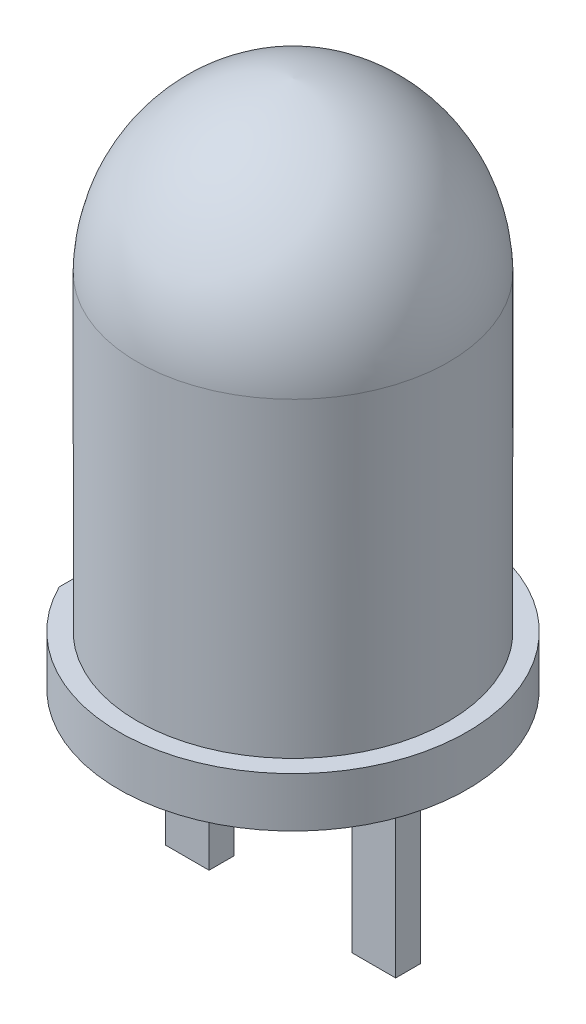
ISO-10303-21;
HEADER;
FILE_DESCRIPTION(('STEP AP214'),'2;1');
FILE_NAME('part.step','',(''),(''),'','','');
FILE_SCHEMA(('AUTOMOTIVE_DESIGN { 1 0 10303 214 1 1 1 1 }'));
ENDSEC;
DATA;
#1=APPLICATION_CONTEXT('core data for automotive mechanical design processes');
#2=APPLICATION_PROTOCOL_DEFINITION('international standard','automotive_design',2000,#1);
#3=PRODUCT_CONTEXT('',#1,'mechanical');
#4=PRODUCT('Part','Part','',(#3));
#5=PRODUCT_RELATED_PRODUCT_CATEGORY('part','',(#4));
#6=PRODUCT_DEFINITION_FORMATION('','',#4);
#7=PRODUCT_DEFINITION_CONTEXT('part definition',#1,'design');
#8=PRODUCT_DEFINITION('design','',#6,#7);
#9=PRODUCT_DEFINITION_SHAPE('','',#8);
#10=(LENGTH_UNIT() NAMED_UNIT(*) SI_UNIT(.MILLI.,.METRE.));
#11=(NAMED_UNIT(*) PLANE_ANGLE_UNIT() SI_UNIT($,.RADIAN.));
#12=(NAMED_UNIT(*) SI_UNIT($,.STERADIAN.) SOLID_ANGLE_UNIT());
#13=UNCERTAINTY_MEASURE_WITH_UNIT(LENGTH_MEASURE(1.E-05),#10,'distance_accuracy_value','');
#14=(GEOMETRIC_REPRESENTATION_CONTEXT(3) GLOBAL_UNCERTAINTY_ASSIGNED_CONTEXT((#13)) GLOBAL_UNIT_ASSIGNED_CONTEXT((#10,
#11,#12)) REPRESENTATION_CONTEXT('',''));
#15=CARTESIAN_POINT('',(0.,0.,0.));
#16=DIRECTION('',(0.,0.,1.));
#17=DIRECTION('',(1.,0.,0.));
#18=AXIS2_PLACEMENT_3D('',#15,#16,#17);
#19=CARTESIAN_POINT('',(0.,0.,0.));
#20=DIRECTION('',(0.,-1.,0.));
#21=DIRECTION('',(0.,0.,-1.));
#22=AXIS2_PLACEMENT_3D('',#19,#20,#21);
#23=PLANE('',#22);
#24=DIRECTION('',(0.,0.,-1.));
#25=VECTOR('',#24,1.);
#26=CARTESIAN_POINT('',(-1.15,0.,0.2));
#27=LINE('',#26,#25);
#28=CARTESIAN_POINT('',(-1.15,0.,0.2));
#29=VERTEX_POINT('',#28);
#30=CARTESIAN_POINT('',(-1.15,0.,-0.2));
#31=VERTEX_POINT('',#30);
#32=EDGE_CURVE('E89',#29,#31,#27,.T.);
#33=ORIENTED_EDGE('',*,*,#32,.T.);
#34=DIRECTION('',(1.,0.,0.));
#35=VECTOR('',#34,1.);
#36=CARTESIAN_POINT('',(0.,0.,-0.2));
#37=LINE('',#36,#35);
#38=CARTESIAN_POINT('',(-1.85,0.,-0.2));
#39=VERTEX_POINT('',#38);
#40=EDGE_CURVE('E94',#39,#31,#37,.T.);
#41=ORIENTED_EDGE('',*,*,#40,.F.);
#42=DIRECTION('',(0.,0.,-1.));
#43=VECTOR('',#42,1.);
#44=CARTESIAN_POINT('',(-1.85,0.,0.2));
#45=LINE('',#44,#43);
#46=CARTESIAN_POINT('',(-1.85,0.,0.2));
#47=VERTEX_POINT('',#46);
#48=EDGE_CURVE('E152',#47,#39,#45,.T.);
#49=ORIENTED_EDGE('',*,*,#48,.F.);
#50=DIRECTION('',(1.,0.,0.));
#51=VECTOR('',#50,1.);
#52=CARTESIAN_POINT('',(-1.85,0.,0.2));
#53=LINE('',#52,#51);
#54=EDGE_CURVE('E156',#47,#29,#53,.T.);
#55=ORIENTED_EDGE('',*,*,#54,.T.);
#56=EDGE_LOOP('',(#33,#41,#49,#55));
#57=FACE_BOUND('',#56,.T.);
#58=DIRECTION('',(0.,0.,1.));
#59=VECTOR('',#58,1.);
#60=CARTESIAN_POINT('',(-2.5,0.,0.));
#61=LINE('',#60,#59);
#62=CARTESIAN_POINT('',(-2.5,0.,-1.26095202129185));
#63=VERTEX_POINT('',#62);
#64=CARTESIAN_POINT('',(-2.5,0.,1.26095202129185));
#65=VERTEX_POINT('',#64);
#66=EDGE_CURVE('E225',#63,#65,#61,.T.);
#67=ORIENTED_EDGE('',*,*,#66,.F.);
#68=CARTESIAN_POINT('',(0.,0.,0.));
#69=DIRECTION('',(0.,-1.,0.));
#70=DIRECTION('',(0.,0.,-1.));
#71=AXIS2_PLACEMENT_3D('',#68,#69,#70);
#72=CIRCLE('',#71,2.8);
#73=EDGE_CURVE('E227',#63,#65,#72,.T.);
#74=ORIENTED_EDGE('',*,*,#73,.T.);
#75=EDGE_LOOP('',(#67,#74));
#76=FACE_BOUND('',#75,.T.);
#77=DIRECTION('',(0.,0.,-1.));
#78=VECTOR('',#77,1.);
#79=CARTESIAN_POINT('',(1.15,0.,0.));
#80=LINE('',#79,#78);
#81=CARTESIAN_POINT('',(1.15,0.,0.2));
#82=VERTEX_POINT('',#81);
#83=CARTESIAN_POINT('',(1.15,0.,-0.2));
#84=VERTEX_POINT('',#83);
#85=EDGE_CURVE('E205',#82,#84,#80,.T.);
#86=ORIENTED_EDGE('',*,*,#85,.F.);
#87=DIRECTION('',(-1.,0.,0.));
#88=VECTOR('',#87,1.);
#89=CARTESIAN_POINT('',(0.,0.,0.2));
#90=LINE('',#89,#88);
#91=CARTESIAN_POINT('',(1.85,0.,0.2));
#92=VERTEX_POINT('',#91);
#93=EDGE_CURVE('E161',#92,#82,#90,.T.);
#94=ORIENTED_EDGE('',*,*,#93,.F.);
#95=DIRECTION('',(0.,0.,-1.));
#96=VECTOR('',#95,1.);
#97=CARTESIAN_POINT('',(1.85,0.,0.));
#98=LINE('',#97,#96);
#99=CARTESIAN_POINT('',(1.85,0.,-0.2));
#100=VERTEX_POINT('',#99);
#101=EDGE_CURVE('E194',#92,#100,#98,.T.);
#102=ORIENTED_EDGE('',*,*,#101,.T.);
#103=DIRECTION('',(-1.,0.,0.));
#104=VECTOR('',#103,1.);
#105=CARTESIAN_POINT('',(0.,0.,-0.2));
#106=LINE('',#105,#104);
#107=EDGE_CURVE('E208',#100,#84,#106,.T.);
#108=ORIENTED_EDGE('',*,*,#107,.T.);
#109=EDGE_LOOP('',(#86,#94,#102,#108));
#110=FACE_BOUND('',#109,.T.);
#111=ADVANCED_FACE('F75',(#57,#76,#110),#23,.T.);
#112=CARTESIAN_POINT('',(0.,5.76136244683429,0.249728557418962));
#113=DIRECTION('',(-1.,0.,0.));
#114=DIRECTION('',(0.,0.,-1.));
#115=AXIS2_PLACEMENT_3D('',#112,#113,#114);
#116=CIRCLE('',#115,2.75);
#117=TRIMMED_CURVE('',#116,(PARAMETER_VALUE(-1.47986066512571)),
(PARAMETER_VALUE(1.47986066512571)),.T.,.PARAMETER.);
#118=CARTESIAN_POINT('',(0.,5.76136244683429,0.));
#119=DIRECTION('',(0.,-1.,0.));
#120=AXIS1_PLACEMENT('',#118,#119);
#121=SURFACE_OF_REVOLUTION('',#117,#120);
#122=CARTESIAN_POINT('',(0.,8.5,0.));
#123=VERTEX_POINT('',#122);
#124=VERTEX_LOOP('',#123);
#125=FACE_BOUND('',#124,.T.);
#126=CARTESIAN_POINT('',(0.,5.8,0.));
#127=DIRECTION('',(0.,-1.,0.));
#128=DIRECTION('',(0.,0.,-1.));
#129=AXIS2_PLACEMENT_3D('',#126,#127,#128);
#130=CIRCLE('',#129,2.5);
#131=CARTESIAN_POINT('',(0.,5.8,-2.5));
#132=VERTEX_POINT('',#131);
#133=EDGE_CURVE('E236',#132,#132,#130,.T.);
#134=ORIENTED_EDGE('',*,*,#133,.F.);
#135=EDGE_LOOP('',(#134));
#136=FACE_BOUND('',#135,.T.);
#137=ADVANCED_FACE('F256',(#125,#136),#121,.T.);
#138=CARTESIAN_POINT('',(0.,0.,0.));
#139=DIRECTION('',(0.,-1.,0.));
#140=DIRECTION('',(0.,0.,-1.));
#141=AXIS2_PLACEMENT_3D('',#138,#139,#140);
#142=CYLINDRICAL_SURFACE('',#141,2.5);
#143=ORIENTED_EDGE('',*,*,#133,.T.);
#144=EDGE_LOOP('',(#143));
#145=FACE_BOUND('',#144,.T.);
#146=CARTESIAN_POINT('',(0.,0.8,0.));
#147=DIRECTION('',(0.,-1.,0.));
#148=DIRECTION('',(0.,0.,-1.));
#149=AXIS2_PLACEMENT_3D('',#146,#147,#148);
#150=CIRCLE('',#149,2.5);
#151=CARTESIAN_POINT('',(-2.5,0.8,0.));
#152=VERTEX_POINT('',#151);
#153=EDGE_CURVE('E233',#152,#152,#150,.T.);
#154=ORIENTED_EDGE('',*,*,#153,.F.);
#155=EDGE_LOOP('',(#154));
#156=FACE_BOUND('',#155,.T.);
#157=ADVANCED_FACE('F254',(#145,#156),#142,.T.);
#158=CARTESIAN_POINT('',(2.8,0.8,0.));
#159=DIRECTION('',(0.,1.,0.));
#160=DIRECTION('',(0.,0.,1.));
#161=AXIS2_PLACEMENT_3D('',#158,#159,#160);
#162=PLANE('',#161);
#163=DIRECTION('',(0.,0.,-1.));
#164=VECTOR('',#163,1.);
#165=CARTESIAN_POINT('',(-2.5,0.8,0.));
#166=LINE('',#165,#164);
#167=CARTESIAN_POINT('',(-2.5,0.8,1.26095202129185));
#168=VERTEX_POINT('',#167);
#169=EDGE_CURVE('E223',#168,#152,#166,.T.);
#170=ORIENTED_EDGE('',*,*,#169,.F.);
#171=CARTESIAN_POINT('',(0.,0.8,0.));
#172=DIRECTION('',(0.,-1.,0.));
#173=DIRECTION('',(0.,0.,-1.));
#174=AXIS2_PLACEMENT_3D('',#171,#172,#173);
#175=CIRCLE('',#174,2.8);
#176=CARTESIAN_POINT('',(-2.5,0.8,-1.26095202129185));
#177=VERTEX_POINT('',#176);
#178=EDGE_CURVE('E230',#177,#168,#175,.T.);
#179=ORIENTED_EDGE('',*,*,#178,.F.);
#180=EDGE_CURVE('E222',#152,#177,#166,.T.);
#181=ORIENTED_EDGE('',*,*,#180,.F.);
#182=ORIENTED_EDGE('',*,*,#153,.T.);
#183=EDGE_LOOP('',(#170,#179,#181,#182));
#184=FACE_BOUND('',#183,.T.);
#185=ADVANCED_FACE('F251',(#184),#162,.T.);
#186=CARTESIAN_POINT('',(0.,0.,0.));
#187=DIRECTION('',(0.,-1.,0.));
#188=DIRECTION('',(0.,0.,-1.));
#189=AXIS2_PLACEMENT_3D('',#186,#187,#188);
#190=CYLINDRICAL_SURFACE('',#189,2.8);
#191=DIRECTION('',(0.,-1.,0.));
#192=VECTOR('',#191,1.);
#193=CARTESIAN_POINT('',(-2.5,0.,1.26095202129185));
#194=LINE('',#193,#192);
#195=EDGE_CURVE('E12',#65,#168,#194,.F.);
#196=ORIENTED_EDGE('',*,*,#195,.F.);
#197=ORIENTED_EDGE('',*,*,#73,.F.);
#198=DIRECTION('',(0.,-1.,0.));
#199=VECTOR('',#198,1.);
#200=CARTESIAN_POINT('',(-2.5,0.,-1.26095202129185));
#201=LINE('',#200,#199);
#202=EDGE_CURVE('E82',#177,#63,#201,.T.);
#203=ORIENTED_EDGE('',*,*,#202,.F.);
#204=ORIENTED_EDGE('',*,*,#178,.T.);
#205=EDGE_LOOP('',(#196,#197,#203,#204));
#206=FACE_BOUND('',#205,.T.);
#207=ADVANCED_FACE('F248',(#206),#190,.T.);
#208=CARTESIAN_POINT('',(-2.5,-9.2,0.));
#209=DIRECTION('',(1.,0.,0.));
#210=DIRECTION('',(0.,0.,-1.));
#211=AXIS2_PLACEMENT_3D('',#208,#209,#210);
#212=PLANE('',#211);
#213=ORIENTED_EDGE('',*,*,#66,.T.);
#214=ORIENTED_EDGE('',*,*,#195,.T.);
#215=ORIENTED_EDGE('',*,*,#169,.T.);
#216=ORIENTED_EDGE('',*,*,#180,.T.);
#217=ORIENTED_EDGE('',*,*,#202,.T.);
#218=EDGE_LOOP('',(#213,#214,#215,#216,#217));
#219=FACE_BOUND('',#218,.T.);
#220=ADVANCED_FACE('F241',(#219),#212,.F.);
#221=CARTESIAN_POINT('',(0.,-3.,0.2));
#222=DIRECTION('',(0.,0.,-1.));
#223=DIRECTION('',(-1.,0.,0.));
#224=AXIS2_PLACEMENT_3D('',#221,#222,#223);
#225=PLANE('',#224);
#226=ORIENTED_EDGE('',*,*,#93,.T.);
#227=DIRECTION('',(0.,1.,0.));
#228=VECTOR('',#227,1.);
#229=CARTESIAN_POINT('',(1.15,-3.,0.2));
#230=LINE('',#229,#228);
#231=CARTESIAN_POINT('',(1.15,-3.,0.2));
#232=VERTEX_POINT('',#231);
#233=EDGE_CURVE('E219',#232,#82,#230,.T.);
#234=ORIENTED_EDGE('',*,*,#233,.F.);
#235=DIRECTION('',(-1.,0.,0.));
#236=VECTOR('',#235,1.);
#237=CARTESIAN_POINT('',(0.,-3.,0.2));
#238=LINE('',#237,#236);
#239=CARTESIAN_POINT('',(1.85,-3.,0.2));
#240=VERTEX_POINT('',#239);
#241=EDGE_CURVE('E190',#240,#232,#238,.T.);
#242=ORIENTED_EDGE('',*,*,#241,.F.);
#243=DIRECTION('',(0.,1.,0.));
#244=VECTOR('',#243,1.);
#245=CARTESIAN_POINT('',(1.85,-3.,0.2));
#246=LINE('',#245,#244);
#247=EDGE_CURVE('E202',#240,#92,#246,.T.);
#248=ORIENTED_EDGE('',*,*,#247,.T.);
#249=EDGE_LOOP('',(#226,#234,#242,#248));
#250=FACE_BOUND('',#249,.T.);
#251=ADVANCED_FACE('F299',(#250),#225,.F.);
#252=CARTESIAN_POINT('',(1.15,-3.,0.));
#253=DIRECTION('',(1.,0.,0.));
#254=DIRECTION('',(0.,0.,-1.));
#255=AXIS2_PLACEMENT_3D('',#252,#253,#254);
#256=PLANE('',#255);
#257=ORIENTED_EDGE('',*,*,#85,.T.);
#258=DIRECTION('',(0.,1.,0.));
#259=VECTOR('',#258,1.);
#260=CARTESIAN_POINT('',(1.15,-3.,-0.2));
#261=LINE('',#260,#259);
#262=CARTESIAN_POINT('',(1.15,-3.,-0.2));
#263=VERTEX_POINT('',#262);
#264=EDGE_CURVE('E216',#263,#84,#261,.T.);
#265=ORIENTED_EDGE('',*,*,#264,.F.);
#266=DIRECTION('',(0.,0.,-1.));
#267=VECTOR('',#266,1.);
#268=CARTESIAN_POINT('',(1.15,-3.,0.));
#269=LINE('',#268,#267);
#270=EDGE_CURVE('E193',#232,#263,#269,.T.);
#271=ORIENTED_EDGE('',*,*,#270,.F.);
#272=ORIENTED_EDGE('',*,*,#233,.T.);
#273=EDGE_LOOP('',(#257,#265,#271,#272));
#274=FACE_BOUND('',#273,.T.);
#275=ADVANCED_FACE('F308',(#274),#256,.F.);
#276=CARTESIAN_POINT('',(0.,-3.,-0.2));
#277=DIRECTION('',(0.,0.,-1.));
#278=DIRECTION('',(-1.,0.,0.));
#279=AXIS2_PLACEMENT_3D('',#276,#277,#278);
#280=PLANE('',#279);
#281=ORIENTED_EDGE('',*,*,#107,.F.);
#282=DIRECTION('',(0.,1.,0.));
#283=VECTOR('',#282,1.);
#284=CARTESIAN_POINT('',(1.85,-3.,-0.2));
#285=LINE('',#284,#283);
#286=CARTESIAN_POINT('',(1.85,-3.,-0.2));
#287=VERTEX_POINT('',#286);
#288=EDGE_CURVE('E213',#287,#100,#285,.T.);
#289=ORIENTED_EDGE('',*,*,#288,.F.);
#290=DIRECTION('',(-1.,0.,0.));
#291=VECTOR('',#290,1.);
#292=CARTESIAN_POINT('',(0.,-3.,-0.2));
#293=LINE('',#292,#291);
#294=EDGE_CURVE('E196',#287,#263,#293,.T.);
#295=ORIENTED_EDGE('',*,*,#294,.T.);
#296=ORIENTED_EDGE('',*,*,#264,.T.);
#297=EDGE_LOOP('',(#281,#289,#295,#296));
#298=FACE_BOUND('',#297,.T.);
#299=ADVANCED_FACE('F318',(#298),#280,.T.);
#300=CARTESIAN_POINT('',(1.85,-3.,0.));
#301=DIRECTION('',(1.,0.,0.));
#302=DIRECTION('',(0.,0.,-1.));
#303=AXIS2_PLACEMENT_3D('',#300,#301,#302);
#304=PLANE('',#303);
#305=ORIENTED_EDGE('',*,*,#101,.F.);
#306=ORIENTED_EDGE('',*,*,#247,.F.);
#307=DIRECTION('',(0.,0.,-1.));
#308=VECTOR('',#307,1.);
#309=CARTESIAN_POINT('',(1.85,-3.,0.));
#310=LINE('',#309,#308);
#311=EDGE_CURVE('E199',#240,#287,#310,.T.);
#312=ORIENTED_EDGE('',*,*,#311,.T.);
#313=ORIENTED_EDGE('',*,*,#288,.T.);
#314=EDGE_LOOP('',(#305,#306,#312,#313));
#315=FACE_BOUND('',#314,.T.);
#316=ADVANCED_FACE('F328',(#315),#304,.T.);
#317=CARTESIAN_POINT('',(0.,-3.,0.));
#318=DIRECTION('',(0.,-1.,0.));
#319=DIRECTION('',(0.,0.,-1.));
#320=AXIS2_PLACEMENT_3D('',#317,#318,#319);
#321=PLANE('',#320);
#322=ORIENTED_EDGE('',*,*,#241,.T.);
#323=ORIENTED_EDGE('',*,*,#270,.T.);
#324=ORIENTED_EDGE('',*,*,#294,.F.);
#325=ORIENTED_EDGE('',*,*,#311,.F.);
#326=EDGE_LOOP('',(#322,#323,#324,#325));
#327=FACE_BOUND('',#326,.T.);
#328=ADVANCED_FACE('F338',(#327),#321,.T.);
#329=CARTESIAN_POINT('',(-1.15,-3.,0.));
#330=DIRECTION('',(1.,0.,0.));
#331=DIRECTION('',(0.,0.,-1.));
#332=AXIS2_PLACEMENT_3D('',#329,#330,#331);
#333=PLANE('',#332);
#334=DIRECTION('',(0.,1.,0.));
#335=VECTOR('',#334,1.);
#336=CARTESIAN_POINT('',(-1.15,-3.,-0.2));
#337=LINE('',#336,#335);
#338=CARTESIAN_POINT('',(-1.15,-3.,-0.2));
#339=VERTEX_POINT('',#338);
#340=EDGE_CURVE('E184',#339,#31,#337,.T.);
#341=ORIENTED_EDGE('',*,*,#340,.T.);
#342=ORIENTED_EDGE('',*,*,#32,.F.);
#343=DIRECTION('',(0.,1.,0.));
#344=VECTOR('',#343,1.);
#345=CARTESIAN_POINT('',(-1.15,-3.,0.2));
#346=LINE('',#345,#344);
#347=CARTESIAN_POINT('',(-1.15,-3.,0.2));
#348=VERTEX_POINT('',#347);
#349=EDGE_CURVE('E171',#348,#29,#346,.T.);
#350=ORIENTED_EDGE('',*,*,#349,.F.);
#351=DIRECTION('',(0.,0.,-1.));
#352=VECTOR('',#351,1.);
#353=CARTESIAN_POINT('',(-1.15,-3.,0.2));
#354=LINE('',#353,#352);
#355=EDGE_CURVE('E176',#348,#339,#354,.T.);
#356=ORIENTED_EDGE('',*,*,#355,.T.);
#357=EDGE_LOOP('',(#341,#342,#350,#356));
#358=FACE_BOUND('',#357,.T.);
#359=ADVANCED_FACE('F348',(#358),#333,.T.);
#360=CARTESIAN_POINT('',(0.,-3.,-0.2));
#361=DIRECTION('',(0.,0.,1.));
#362=DIRECTION('',(1.,0.,0.));
#363=AXIS2_PLACEMENT_3D('',#360,#361,#362);
#364=PLANE('',#363);
#365=ORIENTED_EDGE('',*,*,#40,.T.);
#366=ORIENTED_EDGE('',*,*,#340,.F.);
#367=DIRECTION('',(1.,0.,0.));
#368=VECTOR('',#367,1.);
#369=CARTESIAN_POINT('',(0.,-3.,-0.2));
#370=LINE('',#369,#368);
#371=CARTESIAN_POINT('',(-1.85,-3.,-0.2));
#372=VERTEX_POINT('',#371);
#373=EDGE_CURVE('E186',#372,#339,#370,.T.);
#374=ORIENTED_EDGE('',*,*,#373,.F.);
#375=DIRECTION('',(0.,1.,0.));
#376=VECTOR('',#375,1.);
#377=CARTESIAN_POINT('',(-1.85,-3.,-0.2));
#378=LINE('',#377,#376);
#379=EDGE_CURVE('E182',#372,#39,#378,.T.);
#380=ORIENTED_EDGE('',*,*,#379,.T.);
#381=EDGE_LOOP('',(#365,#366,#374,#380));
#382=FACE_BOUND('',#381,.T.);
#383=ADVANCED_FACE('F358',(#382),#364,.F.);
#384=CARTESIAN_POINT('',(-1.85,-3.,0.));
#385=DIRECTION('',(1.,0.,0.));
#386=DIRECTION('',(0.,0.,-1.));
#387=AXIS2_PLACEMENT_3D('',#384,#385,#386);
#388=PLANE('',#387);
#389=ORIENTED_EDGE('',*,*,#48,.T.);
#390=ORIENTED_EDGE('',*,*,#379,.F.);
#391=DIRECTION('',(0.,0.,-1.));
#392=VECTOR('',#391,1.);
#393=CARTESIAN_POINT('',(-1.85,-3.,0.2));
#394=LINE('',#393,#392);
#395=CARTESIAN_POINT('',(-1.85,-3.,0.2));
#396=VERTEX_POINT('',#395);
#397=EDGE_CURVE('E166',#396,#372,#394,.T.);
#398=ORIENTED_EDGE('',*,*,#397,.F.);
#399=DIRECTION('',(0.,1.,0.));
#400=VECTOR('',#399,1.);
#401=CARTESIAN_POINT('',(-1.85,-3.,0.2));
#402=LINE('',#401,#400);
#403=EDGE_CURVE('E164',#396,#47,#402,.T.);
#404=ORIENTED_EDGE('',*,*,#403,.T.);
#405=EDGE_LOOP('',(#389,#390,#398,#404));
#406=FACE_BOUND('',#405,.T.);
#407=ADVANCED_FACE('F165',(#406),#388,.F.);
#408=CARTESIAN_POINT('',(0.,-3.,0.));
#409=DIRECTION('',(0.,-1.,0.));
#410=DIRECTION('',(0.,0.,-1.));
#411=AXIS2_PLACEMENT_3D('',#408,#409,#410);
#412=PLANE('',#411);
#413=ORIENTED_EDGE('',*,*,#373,.T.);
#414=ORIENTED_EDGE('',*,*,#355,.F.);
#415=DIRECTION('',(1.,0.,0.));
#416=VECTOR('',#415,1.);
#417=CARTESIAN_POINT('',(-1.85,-3.,0.2));
#418=LINE('',#417,#416);
#419=EDGE_CURVE('E170',#396,#348,#418,.T.);
#420=ORIENTED_EDGE('',*,*,#419,.F.);
#421=ORIENTED_EDGE('',*,*,#397,.T.);
#422=EDGE_LOOP('',(#413,#414,#420,#421));
#423=FACE_BOUND('',#422,.T.);
#424=ADVANCED_FACE('F377',(#423),#412,.T.);
#425=CARTESIAN_POINT('',(-1.85,-3.,0.2));
#426=DIRECTION('',(0.,0.,1.));
#427=DIRECTION('',(1.,0.,0.));
#428=AXIS2_PLACEMENT_3D('',#425,#426,#427);
#429=PLANE('',#428);
#430=ORIENTED_EDGE('',*,*,#54,.F.);
#431=ORIENTED_EDGE('',*,*,#403,.F.);
#432=ORIENTED_EDGE('',*,*,#419,.T.);
#433=ORIENTED_EDGE('',*,*,#349,.T.);
#434=EDGE_LOOP('',(#430,#431,#432,#433));
#435=FACE_BOUND('',#434,.T.);
#436=ADVANCED_FACE('F173',(#435),#429,.T.);
#437=CLOSED_SHELL('',(#111,#137,#157,#185,#207,#220,#251,#275,#299,#316,#328,#359,#383,#407,
#424,#436));
#438=MANIFOLD_SOLID_BREP('B2',#437);
#439=ADVANCED_BREP_SHAPE_REPRESENTATION('',(#18,#438),#14);
#440=SHAPE_DEFINITION_REPRESENTATION(#9,#439);
ENDSEC;
END-ISO-10303-21;
